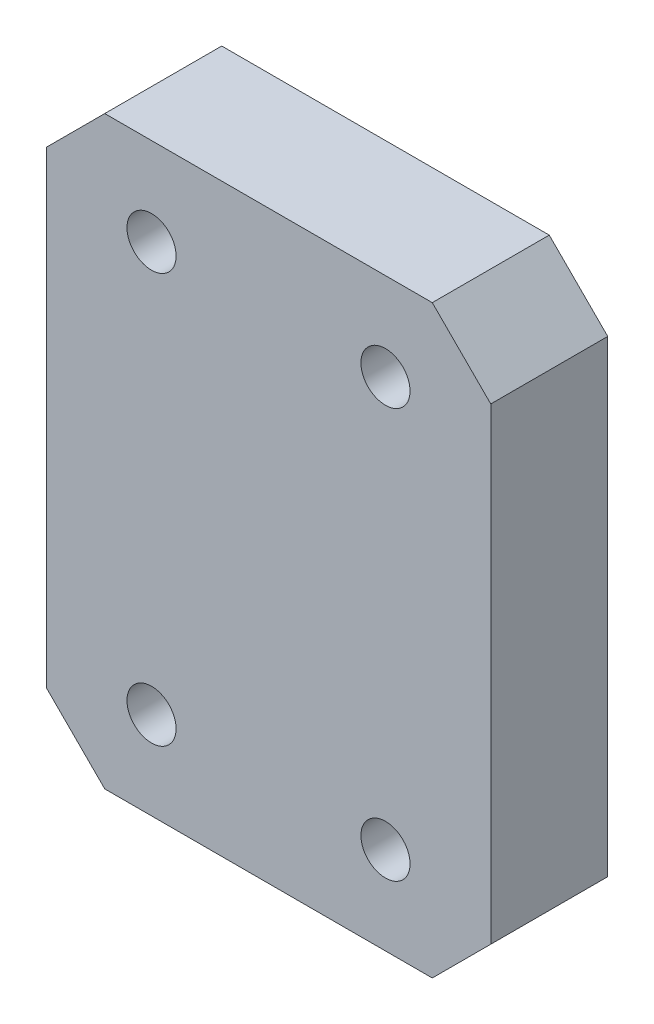
ISO-10303-21;
HEADER;
FILE_DESCRIPTION(('STEP AP214'),'2;1');
FILE_NAME('part.step','',(''),(''),'','','');
FILE_SCHEMA(('AUTOMOTIVE_DESIGN { 1 0 10303 214 1 1 1 1 }'));
ENDSEC;
DATA;
#1=APPLICATION_CONTEXT('core data for automotive mechanical design processes');
#2=APPLICATION_PROTOCOL_DEFINITION('international standard','automotive_design',2000,#1);
#3=PRODUCT_CONTEXT('',#1,'mechanical');
#4=PRODUCT('Part','Part','',(#3));
#5=PRODUCT_RELATED_PRODUCT_CATEGORY('part','',(#4));
#6=PRODUCT_DEFINITION_FORMATION('','',#4);
#7=PRODUCT_DEFINITION_CONTEXT('part definition',#1,'design');
#8=PRODUCT_DEFINITION('design','',#6,#7);
#9=PRODUCT_DEFINITION_SHAPE('','',#8);
#10=(LENGTH_UNIT() NAMED_UNIT(*) SI_UNIT(.MILLI.,.METRE.));
#11=(NAMED_UNIT(*) PLANE_ANGLE_UNIT() SI_UNIT($,.RADIAN.));
#12=(NAMED_UNIT(*) SI_UNIT($,.STERADIAN.) SOLID_ANGLE_UNIT());
#13=UNCERTAINTY_MEASURE_WITH_UNIT(LENGTH_MEASURE(1.E-05),#10,'distance_accuracy_value','');
#14=(GEOMETRIC_REPRESENTATION_CONTEXT(3) GLOBAL_UNCERTAINTY_ASSIGNED_CONTEXT((#13)) GLOBAL_UNIT_ASSIGNED_CONTEXT((#10,
#11,#12)) REPRESENTATION_CONTEXT('',''));
#15=CARTESIAN_POINT('',(0.,0.,0.));
#16=DIRECTION('',(0.,0.,1.));
#17=DIRECTION('',(1.,0.,0.));
#18=AXIS2_PLACEMENT_3D('',#15,#16,#17);
#19=CARTESIAN_POINT('',(19.,-25.,10.));
#20=DIRECTION('',(-1.,0.,0.));
#21=DIRECTION('',(0.,0.,1.));
#22=AXIS2_PLACEMENT_3D('',#19,#20,#21);
#23=PLANE('',#22);
#24=DIRECTION('',(0.,1.,0.));
#25=VECTOR('',#24,1.);
#26=CARTESIAN_POINT('',(19.,-25.,10.));
#27=LINE('',#26,#25);
#28=CARTESIAN_POINT('',(19.,-20.,10.));
#29=VERTEX_POINT('',#28);
#30=CARTESIAN_POINT('',(19.,20.,10.));
#31=VERTEX_POINT('',#30);
#32=EDGE_CURVE('E127',#29,#31,#27,.T.);
#33=ORIENTED_EDGE('',*,*,#32,.F.);
#34=DIRECTION('',(0.,0.,-1.));
#35=VECTOR('',#34,1.);
#36=CARTESIAN_POINT('',(19.,-20.,10.));
#37=LINE('',#36,#35);
#38=CARTESIAN_POINT('',(19.,-20.,0.));
#39=VERTEX_POINT('',#38);
#40=EDGE_CURVE('E153',#29,#39,#37,.T.);
#41=ORIENTED_EDGE('',*,*,#40,.T.);
#42=DIRECTION('',(0.,1.,0.));
#43=VECTOR('',#42,1.);
#44=CARTESIAN_POINT('',(19.,-25.,0.));
#45=LINE('',#44,#43);
#46=CARTESIAN_POINT('',(19.,20.,0.));
#47=VERTEX_POINT('',#46);
#48=EDGE_CURVE('E159',#39,#47,#45,.T.);
#49=ORIENTED_EDGE('',*,*,#48,.T.);
#50=DIRECTION('',(0.,0.,1.));
#51=VECTOR('',#50,1.);
#52=CARTESIAN_POINT('',(19.,20.,10.));
#53=LINE('',#52,#51);
#54=EDGE_CURVE('E151',#47,#31,#53,.T.);
#55=ORIENTED_EDGE('',*,*,#54,.T.);
#56=EDGE_LOOP('',(#33,#41,#49,#55));
#57=FACE_BOUND('',#56,.T.);
#58=ADVANCED_FACE('F34',(#57),#23,.F.);
#59=CARTESIAN_POINT('',(-19.,25.,10.));
#60=DIRECTION('',(0.,-1.,0.));
#61=DIRECTION('',(0.,0.,-1.));
#62=AXIS2_PLACEMENT_3D('',#59,#60,#61);
#63=PLANE('',#62);
#64=DIRECTION('',(-1.,0.,0.));
#65=VECTOR('',#64,1.);
#66=CARTESIAN_POINT('',(-19.,25.,10.));
#67=LINE('',#66,#65);
#68=CARTESIAN_POINT('',(14.,25.,10.));
#69=VERTEX_POINT('',#68);
#70=CARTESIAN_POINT('',(-14.,25.,10.));
#71=VERTEX_POINT('',#70);
#72=EDGE_CURVE('E130',#69,#71,#67,.T.);
#73=ORIENTED_EDGE('',*,*,#72,.F.);
#74=DIRECTION('',(0.,0.,-1.));
#75=VECTOR('',#74,1.);
#76=CARTESIAN_POINT('',(14.,25.,10.));
#77=LINE('',#76,#75);
#78=CARTESIAN_POINT('',(14.,25.,0.));
#79=VERTEX_POINT('',#78);
#80=EDGE_CURVE('E11',#69,#79,#77,.T.);
#81=ORIENTED_EDGE('',*,*,#80,.T.);
#82=DIRECTION('',(-1.,0.,0.));
#83=VECTOR('',#82,1.);
#84=CARTESIAN_POINT('',(-19.,25.,0.));
#85=LINE('',#84,#83);
#86=CARTESIAN_POINT('',(-14.,25.,0.));
#87=VERTEX_POINT('',#86);
#88=EDGE_CURVE('E132',#79,#87,#85,.T.);
#89=ORIENTED_EDGE('',*,*,#88,.T.);
#90=DIRECTION('',(0.,0.,1.));
#91=VECTOR('',#90,1.);
#92=CARTESIAN_POINT('',(-14.,25.,10.));
#93=LINE('',#92,#91);
#94=EDGE_CURVE('E43',#87,#71,#93,.T.);
#95=ORIENTED_EDGE('',*,*,#94,.T.);
#96=EDGE_LOOP('',(#73,#81,#89,#95));
#97=FACE_BOUND('',#96,.T.);
#98=ADVANCED_FACE('F221',(#97),#63,.F.);
#99=CARTESIAN_POINT('',(-19.,-25.,10.));
#100=DIRECTION('',(1.,0.,0.));
#101=DIRECTION('',(0.,0.,-1.));
#102=AXIS2_PLACEMENT_3D('',#99,#100,#101);
#103=PLANE('',#102);
#104=DIRECTION('',(0.,-1.,0.));
#105=VECTOR('',#104,1.);
#106=CARTESIAN_POINT('',(-19.,-25.,0.));
#107=LINE('',#106,#105);
#108=CARTESIAN_POINT('',(-19.,20.,0.));
#109=VERTEX_POINT('',#108);
#110=CARTESIAN_POINT('',(-19.,-20.,0.));
#111=VERTEX_POINT('',#110);
#112=EDGE_CURVE('E128',#109,#111,#107,.T.);
#113=ORIENTED_EDGE('',*,*,#112,.T.);
#114=DIRECTION('',(0.,0.,1.));
#115=VECTOR('',#114,1.);
#116=CARTESIAN_POINT('',(-19.,-20.,10.));
#117=LINE('',#116,#115);
#118=CARTESIAN_POINT('',(-19.,-20.,10.));
#119=VERTEX_POINT('',#118);
#120=EDGE_CURVE('E106',#111,#119,#117,.T.);
#121=ORIENTED_EDGE('',*,*,#120,.T.);
#122=DIRECTION('',(0.,-1.,0.));
#123=VECTOR('',#122,1.);
#124=CARTESIAN_POINT('',(-19.,-25.,10.));
#125=LINE('',#124,#123);
#126=CARTESIAN_POINT('',(-19.,20.,10.));
#127=VERTEX_POINT('',#126);
#128=EDGE_CURVE('E171',#127,#119,#125,.T.);
#129=ORIENTED_EDGE('',*,*,#128,.F.);
#130=DIRECTION('',(0.,0.,-1.));
#131=VECTOR('',#130,1.);
#132=CARTESIAN_POINT('',(-19.,20.,10.));
#133=LINE('',#132,#131);
#134=EDGE_CURVE('E111',#127,#109,#133,.T.);
#135=ORIENTED_EDGE('',*,*,#134,.T.);
#136=EDGE_LOOP('',(#113,#121,#129,#135));
#137=FACE_BOUND('',#136,.T.);
#138=ADVANCED_FACE('F219',(#137),#103,.F.);
#139=CARTESIAN_POINT('',(-19.,-25.,10.));
#140=DIRECTION('',(0.,1.,0.));
#141=DIRECTION('',(0.,0.,1.));
#142=AXIS2_PLACEMENT_3D('',#139,#140,#141);
#143=PLANE('',#142);
#144=DIRECTION('',(1.,0.,0.));
#145=VECTOR('',#144,1.);
#146=CARTESIAN_POINT('',(-19.,-25.,10.));
#147=LINE('',#146,#145);
#148=CARTESIAN_POINT('',(-14.,-25.,10.));
#149=VERTEX_POINT('',#148);
#150=CARTESIAN_POINT('',(14.,-25.,10.));
#151=VERTEX_POINT('',#150);
#152=EDGE_CURVE('E121',#149,#151,#147,.T.);
#153=ORIENTED_EDGE('',*,*,#152,.F.);
#154=DIRECTION('',(0.,0.,-1.));
#155=VECTOR('',#154,1.);
#156=CARTESIAN_POINT('',(-14.,-25.,10.));
#157=LINE('',#156,#155);
#158=CARTESIAN_POINT('',(-14.,-25.,0.));
#159=VERTEX_POINT('',#158);
#160=EDGE_CURVE('E105',#149,#159,#157,.T.);
#161=ORIENTED_EDGE('',*,*,#160,.T.);
#162=DIRECTION('',(1.,0.,0.));
#163=VECTOR('',#162,1.);
#164=CARTESIAN_POINT('',(-19.,-25.,0.));
#165=LINE('',#164,#163);
#166=CARTESIAN_POINT('',(14.,-25.,0.));
#167=VERTEX_POINT('',#166);
#168=EDGE_CURVE('E118',#159,#167,#165,.T.);
#169=ORIENTED_EDGE('',*,*,#168,.T.);
#170=DIRECTION('',(0.,0.,1.));
#171=VECTOR('',#170,1.);
#172=CARTESIAN_POINT('',(14.,-25.,10.));
#173=LINE('',#172,#171);
#174=EDGE_CURVE('E123',#167,#151,#173,.T.);
#175=ORIENTED_EDGE('',*,*,#174,.T.);
#176=EDGE_LOOP('',(#153,#161,#169,#175));
#177=FACE_BOUND('',#176,.T.);
#178=ADVANCED_FACE('F117',(#177),#143,.F.);
#179=CARTESIAN_POINT('',(0.,0.,10.));
#180=DIRECTION('',(0.,0.,-1.));
#181=DIRECTION('',(-1.,0.,0.));
#182=AXIS2_PLACEMENT_3D('',#179,#180,#181);
#183=PLANE('',#182);
#184=CARTESIAN_POINT('',(-10.,17.5,10.));
#185=DIRECTION('',(0.,0.,-1.));
#186=DIRECTION('',(-1.,0.,0.));
#187=AXIS2_PLACEMENT_3D('',#184,#185,#186);
#188=CIRCLE('',#187,2.1);
#189=CARTESIAN_POINT('',(-12.1,17.5,10.));
#190=VERTEX_POINT('',#189);
#191=EDGE_CURVE('E177',#190,#190,#188,.F.);
#192=ORIENTED_EDGE('',*,*,#191,.F.);
#193=EDGE_LOOP('',(#192));
#194=FACE_BOUND('',#193,.T.);
#195=CARTESIAN_POINT('',(10.,-17.5,10.));
#196=DIRECTION('',(0.,0.,-1.));
#197=DIRECTION('',(-1.,0.,0.));
#198=AXIS2_PLACEMENT_3D('',#195,#196,#197);
#199=CIRCLE('',#198,2.1);
#200=CARTESIAN_POINT('',(7.9,-17.5,10.));
#201=VERTEX_POINT('',#200);
#202=EDGE_CURVE('E178',#201,#201,#199,.F.);
#203=ORIENTED_EDGE('',*,*,#202,.F.);
#204=EDGE_LOOP('',(#203));
#205=FACE_BOUND('',#204,.T.);
#206=CARTESIAN_POINT('',(-10.,-17.5,10.));
#207=DIRECTION('',(0.,0.,-1.));
#208=DIRECTION('',(-1.,0.,0.));
#209=AXIS2_PLACEMENT_3D('',#206,#207,#208);
#210=CIRCLE('',#209,2.1);
#211=CARTESIAN_POINT('',(-12.1,-17.5,10.));
#212=VERTEX_POINT('',#211);
#213=EDGE_CURVE('E185',#212,#212,#210,.F.);
#214=ORIENTED_EDGE('',*,*,#213,.F.);
#215=EDGE_LOOP('',(#214));
#216=FACE_BOUND('',#215,.T.);
#217=CARTESIAN_POINT('',(10.,17.5,10.));
#218=DIRECTION('',(0.,0.,-1.));
#219=DIRECTION('',(-1.,0.,0.));
#220=AXIS2_PLACEMENT_3D('',#217,#218,#219);
#221=CIRCLE('',#220,2.1);
#222=CARTESIAN_POINT('',(7.9,17.5,10.));
#223=VERTEX_POINT('',#222);
#224=EDGE_CURVE('E164',#223,#223,#221,.F.);
#225=ORIENTED_EDGE('',*,*,#224,.F.);
#226=EDGE_LOOP('',(#225));
#227=FACE_BOUND('',#226,.T.);
#228=ORIENTED_EDGE('',*,*,#128,.T.);
#229=DIRECTION('',(-0.707106781186547,0.707106781186549,0.));
#230=VECTOR('',#229,1.);
#231=CARTESIAN_POINT('',(-14.,-25.,10.));
#232=LINE('',#231,#230);
#233=EDGE_CURVE('E149',#119,#149,#232,.F.);
#234=ORIENTED_EDGE('',*,*,#233,.T.);
#235=ORIENTED_EDGE('',*,*,#152,.T.);
#236=DIRECTION('',(-0.707106781186549,-0.707106781186547,0.));
#237=VECTOR('',#236,1.);
#238=CARTESIAN_POINT('',(19.,-20.,10.));
#239=LINE('',#238,#237);
#240=EDGE_CURVE('E147',#151,#29,#239,.F.);
#241=ORIENTED_EDGE('',*,*,#240,.T.);
#242=ORIENTED_EDGE('',*,*,#32,.T.);
#243=DIRECTION('',(0.707106781186547,-0.707106781186549,0.));
#244=VECTOR('',#243,1.);
#245=CARTESIAN_POINT('',(14.,25.,10.));
#246=LINE('',#245,#244);
#247=EDGE_CURVE('E56',#31,#69,#246,.F.);
#248=ORIENTED_EDGE('',*,*,#247,.T.);
#249=ORIENTED_EDGE('',*,*,#72,.T.);
#250=DIRECTION('',(0.707106781186549,0.707106781186547,0.));
#251=VECTOR('',#250,1.);
#252=CARTESIAN_POINT('',(-19.,20.,10.));
#253=LINE('',#252,#251);
#254=EDGE_CURVE('E144',#71,#127,#253,.F.);
#255=ORIENTED_EDGE('',*,*,#254,.T.);
#256=EDGE_LOOP('',(#228,#234,#235,#241,#242,#248,#249,#255));
#257=FACE_BOUND('',#256,.T.);
#258=ADVANCED_FACE('F201',(#194,#205,#216,#227,#257),#183,.F.);
#259=CARTESIAN_POINT('',(0.,0.,0.));
#260=DIRECTION('',(0.,0.,-1.));
#261=DIRECTION('',(-1.,0.,0.));
#262=AXIS2_PLACEMENT_3D('',#259,#260,#261);
#263=PLANE('',#262);
#264=CARTESIAN_POINT('',(-10.,17.5,0.));
#265=DIRECTION('',(0.,0.,-1.));
#266=DIRECTION('',(-1.,0.,0.));
#267=AXIS2_PLACEMENT_3D('',#264,#265,#266);
#268=CIRCLE('',#267,2.1);
#269=CARTESIAN_POINT('',(-12.1,17.5,0.));
#270=VERTEX_POINT('',#269);
#271=EDGE_CURVE('E181',#270,#270,#268,.T.);
#272=ORIENTED_EDGE('',*,*,#271,.F.);
#273=EDGE_LOOP('',(#272));
#274=FACE_BOUND('',#273,.T.);
#275=CARTESIAN_POINT('',(10.,-17.5,0.));
#276=DIRECTION('',(0.,0.,-1.));
#277=DIRECTION('',(-1.,0.,0.));
#278=AXIS2_PLACEMENT_3D('',#275,#276,#277);
#279=CIRCLE('',#278,2.1);
#280=CARTESIAN_POINT('',(7.9,-17.5,0.));
#281=VERTEX_POINT('',#280);
#282=EDGE_CURVE('E182',#281,#281,#279,.T.);
#283=ORIENTED_EDGE('',*,*,#282,.F.);
#284=EDGE_LOOP('',(#283));
#285=FACE_BOUND('',#284,.T.);
#286=CARTESIAN_POINT('',(-10.,-17.5,0.));
#287=DIRECTION('',(0.,0.,-1.));
#288=DIRECTION('',(-1.,0.,0.));
#289=AXIS2_PLACEMENT_3D('',#286,#287,#288);
#290=CIRCLE('',#289,2.1);
#291=CARTESIAN_POINT('',(-12.1,-17.5,0.));
#292=VERTEX_POINT('',#291);
#293=EDGE_CURVE('E192',#292,#292,#290,.T.);
#294=ORIENTED_EDGE('',*,*,#293,.F.);
#295=EDGE_LOOP('',(#294));
#296=FACE_BOUND('',#295,.T.);
#297=CARTESIAN_POINT('',(10.,17.5,0.));
#298=DIRECTION('',(0.,0.,-1.));
#299=DIRECTION('',(-1.,0.,0.));
#300=AXIS2_PLACEMENT_3D('',#297,#298,#299);
#301=CIRCLE('',#300,2.1);
#302=CARTESIAN_POINT('',(7.9,17.5,0.));
#303=VERTEX_POINT('',#302);
#304=EDGE_CURVE('E167',#303,#303,#301,.T.);
#305=ORIENTED_EDGE('',*,*,#304,.F.);
#306=EDGE_LOOP('',(#305));
#307=FACE_BOUND('',#306,.T.);
#308=ORIENTED_EDGE('',*,*,#168,.F.);
#309=DIRECTION('',(0.707106781186547,-0.707106781186549,0.));
#310=VECTOR('',#309,1.);
#311=CARTESIAN_POINT('',(-19.5,-19.5,0.));
#312=LINE('',#311,#310);
#313=EDGE_CURVE('E101',#159,#111,#312,.F.);
#314=ORIENTED_EDGE('',*,*,#313,.T.);
#315=ORIENTED_EDGE('',*,*,#112,.F.);
#316=DIRECTION('',(-0.707106781186549,-0.707106781186547,0.));
#317=VECTOR('',#316,1.);
#318=CARTESIAN_POINT('',(-19.5,19.5,0.));
#319=LINE('',#318,#317);
#320=EDGE_CURVE('E122',#109,#87,#319,.F.);
#321=ORIENTED_EDGE('',*,*,#320,.T.);
#322=ORIENTED_EDGE('',*,*,#88,.F.);
#323=DIRECTION('',(-0.707106781186547,0.707106781186549,0.));
#324=VECTOR('',#323,1.);
#325=CARTESIAN_POINT('',(19.5,19.5,0.));
#326=LINE('',#325,#324);
#327=EDGE_CURVE('E138',#79,#47,#326,.F.);
#328=ORIENTED_EDGE('',*,*,#327,.T.);
#329=ORIENTED_EDGE('',*,*,#48,.F.);
#330=DIRECTION('',(0.707106781186549,0.707106781186547,0.));
#331=VECTOR('',#330,1.);
#332=CARTESIAN_POINT('',(19.5,-19.5,0.));
#333=LINE('',#332,#331);
#334=EDGE_CURVE('E112',#39,#167,#333,.F.);
#335=ORIENTED_EDGE('',*,*,#334,.T.);
#336=EDGE_LOOP('',(#308,#314,#315,#321,#322,#328,#329,#335));
#337=FACE_BOUND('',#336,.T.);
#338=ADVANCED_FACE('F125',(#274,#285,#296,#307,#337),#263,.T.);
#339=CARTESIAN_POINT('',(-14.,-25.,10.));
#340=DIRECTION('',(0.707106781186548,0.707106781186546,0.));
#341=DIRECTION('',(0.,0.,-1.));
#342=AXIS2_PLACEMENT_3D('',#339,#340,#341);
#343=PLANE('',#342);
#344=ORIENTED_EDGE('',*,*,#233,.F.);
#345=ORIENTED_EDGE('',*,*,#120,.F.);
#346=ORIENTED_EDGE('',*,*,#313,.F.);
#347=ORIENTED_EDGE('',*,*,#160,.F.);
#348=EDGE_LOOP('',(#344,#345,#346,#347));
#349=FACE_BOUND('',#348,.T.);
#350=ADVANCED_FACE('F104',(#349),#343,.F.);
#351=CARTESIAN_POINT('',(19.,-20.,10.));
#352=DIRECTION('',(-0.707106781186546,0.707106781186548,0.));
#353=DIRECTION('',(0.,0.,-1.));
#354=AXIS2_PLACEMENT_3D('',#351,#352,#353);
#355=PLANE('',#354);
#356=ORIENTED_EDGE('',*,*,#240,.F.);
#357=ORIENTED_EDGE('',*,*,#174,.F.);
#358=ORIENTED_EDGE('',*,*,#334,.F.);
#359=ORIENTED_EDGE('',*,*,#40,.F.);
#360=EDGE_LOOP('',(#356,#357,#358,#359));
#361=FACE_BOUND('',#360,.T.);
#362=ADVANCED_FACE('F225',(#361),#355,.F.);
#363=CARTESIAN_POINT('',(14.,25.,10.));
#364=DIRECTION('',(-0.707106781186548,-0.707106781186546,0.));
#365=DIRECTION('',(0.,0.,-1.));
#366=AXIS2_PLACEMENT_3D('',#363,#364,#365);
#367=PLANE('',#366);
#368=ORIENTED_EDGE('',*,*,#247,.F.);
#369=ORIENTED_EDGE('',*,*,#54,.F.);
#370=ORIENTED_EDGE('',*,*,#327,.F.);
#371=ORIENTED_EDGE('',*,*,#80,.F.);
#372=EDGE_LOOP('',(#368,#369,#370,#371));
#373=FACE_BOUND('',#372,.T.);
#374=ADVANCED_FACE('F224',(#373),#367,.F.);
#375=CARTESIAN_POINT('',(-19.,20.,10.));
#376=DIRECTION('',(0.707106781186546,-0.707106781186548,0.));
#377=DIRECTION('',(0.,0.,-1.));
#378=AXIS2_PLACEMENT_3D('',#375,#376,#377);
#379=PLANE('',#378);
#380=ORIENTED_EDGE('',*,*,#254,.F.);
#381=ORIENTED_EDGE('',*,*,#94,.F.);
#382=ORIENTED_EDGE('',*,*,#320,.F.);
#383=ORIENTED_EDGE('',*,*,#134,.F.);
#384=EDGE_LOOP('',(#380,#381,#382,#383));
#385=FACE_BOUND('',#384,.T.);
#386=ADVANCED_FACE('F37',(#385),#379,.F.);
#387=CARTESIAN_POINT('',(10.,17.5,10.001));
#388=DIRECTION('',(0.,0.,-1.));
#389=DIRECTION('',(-1.,0.,0.));
#390=AXIS2_PLACEMENT_3D('',#387,#388,#389);
#391=CYLINDRICAL_SURFACE('',#390,2.1);
#392=ORIENTED_EDGE('',*,*,#304,.T.);
#393=EDGE_LOOP('',(#392));
#394=FACE_BOUND('',#393,.T.);
#395=ORIENTED_EDGE('',*,*,#224,.T.);
#396=EDGE_LOOP('',(#395));
#397=FACE_BOUND('',#396,.T.);
#398=ADVANCED_FACE('F206',(#394,#397),#391,.F.);
#399=CARTESIAN_POINT('',(-10.,-17.5,10.001));
#400=DIRECTION('',(0.,0.,-1.));
#401=DIRECTION('',(-1.,0.,0.));
#402=AXIS2_PLACEMENT_3D('',#399,#400,#401);
#403=CYLINDRICAL_SURFACE('',#402,2.1);
#404=ORIENTED_EDGE('',*,*,#293,.T.);
#405=EDGE_LOOP('',(#404));
#406=FACE_BOUND('',#405,.T.);
#407=ORIENTED_EDGE('',*,*,#213,.T.);
#408=EDGE_LOOP('',(#407));
#409=FACE_BOUND('',#408,.T.);
#410=ADVANCED_FACE('F196',(#406,#409),#403,.F.);
#411=CARTESIAN_POINT('',(10.,-17.5,10.001));
#412=DIRECTION('',(0.,0.,-1.));
#413=DIRECTION('',(-1.,0.,0.));
#414=AXIS2_PLACEMENT_3D('',#411,#412,#413);
#415=CYLINDRICAL_SURFACE('',#414,2.1);
#416=ORIENTED_EDGE('',*,*,#282,.T.);
#417=EDGE_LOOP('',(#416));
#418=FACE_BOUND('',#417,.T.);
#419=ORIENTED_EDGE('',*,*,#202,.T.);
#420=EDGE_LOOP('',(#419));
#421=FACE_BOUND('',#420,.T.);
#422=ADVANCED_FACE('F255',(#418,#421),#415,.F.);
#423=CARTESIAN_POINT('',(-10.,17.5,10.001));
#424=DIRECTION('',(0.,0.,-1.));
#425=DIRECTION('',(-1.,0.,0.));
#426=AXIS2_PLACEMENT_3D('',#423,#424,#425);
#427=CYLINDRICAL_SURFACE('',#426,2.1);
#428=ORIENTED_EDGE('',*,*,#271,.T.);
#429=EDGE_LOOP('',(#428));
#430=FACE_BOUND('',#429,.T.);
#431=ORIENTED_EDGE('',*,*,#191,.T.);
#432=EDGE_LOOP('',(#431));
#433=FACE_BOUND('',#432,.T.);
#434=ADVANCED_FACE('F258',(#430,#433),#427,.F.);
#435=CLOSED_SHELL('',(#58,#98,#138,#178,#258,#338,#350,#362,#374,#386,#398,#410,#422,#434));
#436=MANIFOLD_SOLID_BREP('B2',#435);
#437=ADVANCED_BREP_SHAPE_REPRESENTATION('',(#18,#436),#14);
#438=SHAPE_DEFINITION_REPRESENTATION(#9,#437);
ENDSEC;
END-ISO-10303-21;
